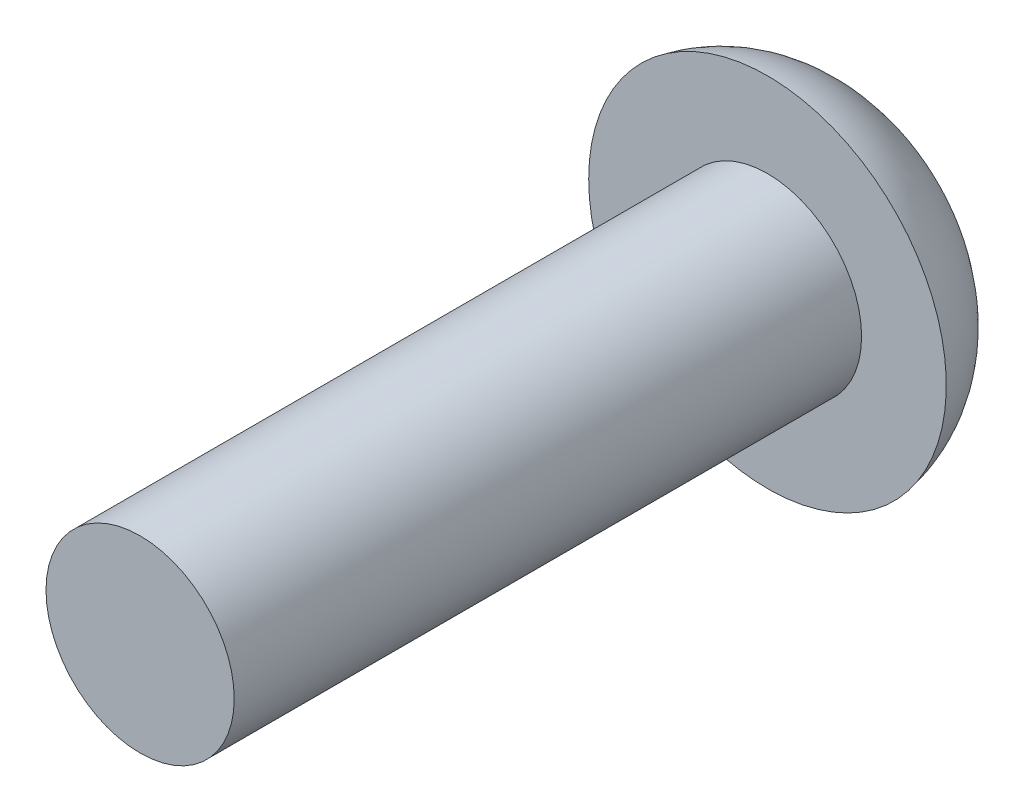
ISO-10303-21;
HEADER;
FILE_DESCRIPTION(('STEP AP214'),'2;1');
FILE_NAME('part.step','',(''),(''),'','','');
FILE_SCHEMA(('AUTOMOTIVE_DESIGN { 1 0 10303 214 1 1 1 1 }'));
ENDSEC;
DATA;
#1=APPLICATION_CONTEXT('core data for automotive mechanical design processes');
#2=APPLICATION_PROTOCOL_DEFINITION('international standard','automotive_design',2000,#1);
#3=PRODUCT_CONTEXT('',#1,'mechanical');
#4=PRODUCT('Part','Part','',(#3));
#5=PRODUCT_RELATED_PRODUCT_CATEGORY('part','',(#4));
#6=PRODUCT_DEFINITION_FORMATION('','',#4);
#7=PRODUCT_DEFINITION_CONTEXT('part definition',#1,'design');
#8=PRODUCT_DEFINITION('design','',#6,#7);
#9=PRODUCT_DEFINITION_SHAPE('','',#8);
#10=(LENGTH_UNIT() NAMED_UNIT(*) SI_UNIT(.MILLI.,.METRE.));
#11=(NAMED_UNIT(*) PLANE_ANGLE_UNIT() SI_UNIT($,.RADIAN.));
#12=(NAMED_UNIT(*) SI_UNIT($,.STERADIAN.) SOLID_ANGLE_UNIT());
#13=UNCERTAINTY_MEASURE_WITH_UNIT(LENGTH_MEASURE(1.E-05),#10,'distance_accuracy_value','');
#14=(GEOMETRIC_REPRESENTATION_CONTEXT(3) GLOBAL_UNCERTAINTY_ASSIGNED_CONTEXT((#13)) GLOBAL_UNIT_ASSIGNED_CONTEXT((#10,
#11,#12)) REPRESENTATION_CONTEXT('',''));
#15=CARTESIAN_POINT('',(0.,0.,0.));
#16=DIRECTION('',(0.,0.,1.));
#17=DIRECTION('',(1.,0.,0.));
#18=AXIS2_PLACEMENT_3D('',#15,#16,#17);
#19=CARTESIAN_POINT('',(0.,0.,10.));
#20=DIRECTION('',(0.,0.,-1.));
#21=DIRECTION('',(-1.,0.,0.));
#22=AXIS2_PLACEMENT_3D('',#19,#20,#21);
#23=CYLINDRICAL_SURFACE('',#22,1.5);
#24=CARTESIAN_POINT('',(0.,0.,10.));
#25=DIRECTION('',(0.,0.,1.));
#26=DIRECTION('',(1.,0.,0.));
#27=AXIS2_PLACEMENT_3D('',#24,#25,#26);
#28=CIRCLE('',#27,1.5);
#29=CARTESIAN_POINT('',(1.5,0.,10.));
#30=VERTEX_POINT('',#29);
#31=EDGE_CURVE('E38',#30,#30,#28,.T.);
#32=ORIENTED_EDGE('',*,*,#31,.F.);
#33=EDGE_LOOP('',(#32));
#34=FACE_BOUND('',#33,.T.);
#35=CARTESIAN_POINT('',(0.,0.,0.));
#36=DIRECTION('',(0.,0.,1.));
#37=DIRECTION('',(1.,0.,0.));
#38=AXIS2_PLACEMENT_3D('',#35,#36,#37);
#39=CIRCLE('',#38,1.5);
#40=CARTESIAN_POINT('',(1.5,0.,0.));
#41=VERTEX_POINT('',#40);
#42=EDGE_CURVE('E42',#41,#41,#39,.T.);
#43=ORIENTED_EDGE('',*,*,#42,.T.);
#44=EDGE_LOOP('',(#43));
#45=FACE_BOUND('',#44,.T.);
#46=ADVANCED_FACE('F31',(#34,#45),#23,.T.);
#47=CARTESIAN_POINT('',(0.,0.,10.));
#48=DIRECTION('',(0.,0.,1.));
#49=DIRECTION('',(1.,0.,0.));
#50=AXIS2_PLACEMENT_3D('',#47,#48,#49);
#51=PLANE('',#50);
#52=ORIENTED_EDGE('',*,*,#31,.T.);
#53=EDGE_LOOP('',(#52));
#54=FACE_BOUND('',#53,.T.);
#55=ADVANCED_FACE('F63',(#54),#51,.T.);
#56=CARTESIAN_POINT('',(0.,0.,-1.65));
#57=DIRECTION('',(0.,0.,-1.));
#58=DIRECTION('',(-1.,0.,0.));
#59=AXIS2_PLACEMENT_3D('',#56,#57,#58);
#60=PLANE('',#59);
#61=CARTESIAN_POINT('',(0.,0.,-1.65));
#62=DIRECTION('',(0.,0.,-1.));
#63=DIRECTION('',(-1.,0.,0.));
#64=AXIS2_PLACEMENT_3D('',#61,#62,#63);
#65=CIRCLE('',#64,0.880863133248479);
#66=CARTESIAN_POINT('',(-0.880863133248479,0.,-1.65));
#67=VERTEX_POINT('',#66);
#68=EDGE_CURVE('E10',#67,#67,#65,.T.);
#69=ORIENTED_EDGE('',*,*,#68,.T.);
#70=EDGE_LOOP('',(#69));
#71=FACE_BOUND('',#70,.T.);
#72=ADVANCED_FACE('F56',(#71),#60,.T.);
#73=CARTESIAN_POINT('',(0.,0.,0.));
#74=DIRECTION('',(0.,0.,-1.));
#75=DIRECTION('',(-1.,0.,0.));
#76=AXIS2_PLACEMENT_3D('',#73,#74,#75);
#77=PLANE('',#76);
#78=ORIENTED_EDGE('',*,*,#42,.F.);
#79=EDGE_LOOP('',(#78));
#80=FACE_BOUND('',#79,.T.);
#81=CARTESIAN_POINT('',(0.,0.,0.));
#82=DIRECTION('',(0.,0.,-1.));
#83=DIRECTION('',(-1.,0.,0.));
#84=AXIS2_PLACEMENT_3D('',#81,#82,#83);
#85=CIRCLE('',#84,2.85);
#86=CARTESIAN_POINT('',(-2.85,0.,0.));
#87=VERTEX_POINT('',#86);
#88=EDGE_CURVE('E47',#87,#87,#85,.T.);
#89=ORIENTED_EDGE('',*,*,#88,.F.);
#90=EDGE_LOOP('',(#89));
#91=FACE_BOUND('',#90,.T.);
#92=ADVANCED_FACE('F54',(#80,#91),#77,.F.);
#93=CARTESIAN_POINT('',(0.,0.,0.35));
#94=DIRECTION('',(0.,0.,1.));
#95=DIRECTION('',(1.,0.,0.));
#96=AXIS2_PLACEMENT_3D('',#93,#94,#95);
#97=DEGENERATE_TOROIDAL_SURFACE('',#96,0.880863133248479,2.,.T.);
#98=ORIENTED_EDGE('',*,*,#88,.T.);
#99=EDGE_LOOP('',(#98));
#100=FACE_BOUND('',#99,.T.);
#101=ORIENTED_EDGE('',*,*,#68,.F.);
#102=EDGE_LOOP('',(#101));
#103=FACE_BOUND('',#102,.T.);
#104=ADVANCED_FACE('F33',(#100,#103),#97,.T.);
#105=CLOSED_SHELL('',(#46,#55,#72,#92,#104));
#106=MANIFOLD_SOLID_BREP('B2',#105);
#107=ADVANCED_BREP_SHAPE_REPRESENTATION('',(#18,#106),#14);
#108=SHAPE_DEFINITION_REPRESENTATION(#9,#107);
ENDSEC;
END-ISO-10303-21;
